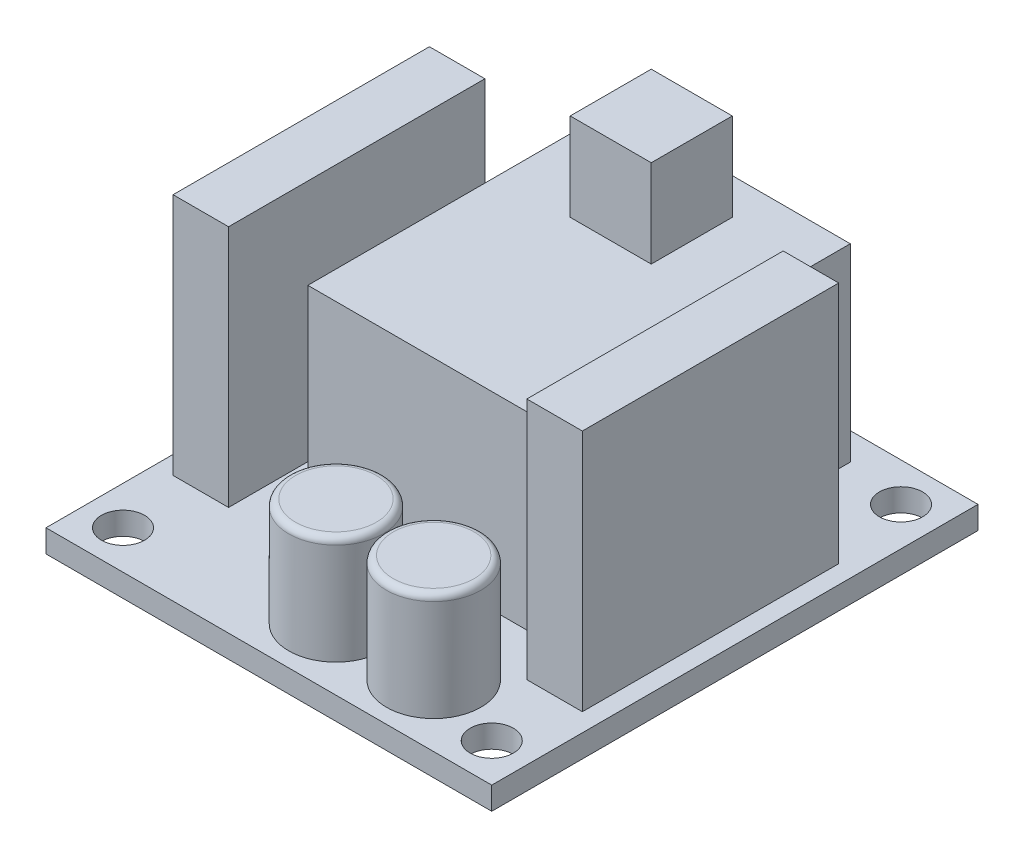
ISO-10303-21;
HEADER;
FILE_DESCRIPTION(('STEP AP214'),'2;1');
FILE_NAME('part.step','',(''),(''),'','','');
FILE_SCHEMA(('AUTOMOTIVE_DESIGN { 1 0 10303 214 1 1 1 1 }'));
ENDSEC;
DATA;
#1=APPLICATION_CONTEXT('core data for automotive mechanical design processes');
#2=APPLICATION_PROTOCOL_DEFINITION('international standard','automotive_design',2000,#1);
#3=PRODUCT_CONTEXT('',#1,'mechanical');
#4=PRODUCT('Part','Part','',(#3));
#5=PRODUCT_RELATED_PRODUCT_CATEGORY('part','',(#4));
#6=PRODUCT_DEFINITION_FORMATION('','',#4);
#7=PRODUCT_DEFINITION_CONTEXT('part definition',#1,'design');
#8=PRODUCT_DEFINITION('design','',#6,#7);
#9=PRODUCT_DEFINITION_SHAPE('','',#8);
#10=(LENGTH_UNIT() NAMED_UNIT(*) SI_UNIT(.MILLI.,.METRE.));
#11=(NAMED_UNIT(*) PLANE_ANGLE_UNIT() SI_UNIT($,.RADIAN.));
#12=(NAMED_UNIT(*) SI_UNIT($,.STERADIAN.) SOLID_ANGLE_UNIT());
#13=UNCERTAINTY_MEASURE_WITH_UNIT(LENGTH_MEASURE(1.E-05),#10,'distance_accuracy_value','');
#14=(GEOMETRIC_REPRESENTATION_CONTEXT(3) GLOBAL_UNCERTAINTY_ASSIGNED_CONTEXT((#13)) GLOBAL_UNIT_ASSIGNED_CONTEXT((#10,
#11,#12)) REPRESENTATION_CONTEXT('',''));
#15=CARTESIAN_POINT('',(0.,0.,0.));
#16=DIRECTION('',(0.,0.,1.));
#17=DIRECTION('',(1.,0.,0.));
#18=AXIS2_PLACEMENT_3D('',#15,#16,#17);
#19=CARTESIAN_POINT('',(0.,1.68,0.));
#20=DIRECTION('',(0.,-1.,0.));
#21=DIRECTION('',(0.,0.,-1.));
#22=AXIS2_PLACEMENT_3D('',#19,#20,#21);
#23=PLANE('',#22);
#24=CARTESIAN_POINT('',(0.380282146725575,1.68,13.4142716533997));
#25=DIRECTION('',(0.,-1.,0.));
#26=DIRECTION('',(0.,0.,-1.));
#27=AXIS2_PLACEMENT_3D('',#24,#25,#26);
#28=CIRCLE('',#27,3.49538502203693);
#29=CARTESIAN_POINT('',(0.380282146725575,1.68,9.91888663136274));
#30=VERTEX_POINT('',#29);
#31=EDGE_CURVE('E361',#30,#30,#28,.F.);
#32=ORIENTED_EDGE('',*,*,#31,.F.);
#33=EDGE_LOOP('',(#32));
#34=FACE_BOUND('',#33,.T.);
#35=CARTESIAN_POINT('',(7.61678506029866,1.68,13.4142716533997));
#36=DIRECTION('',(0.,-1.,0.));
#37=DIRECTION('',(0.,0.,-1.));
#38=AXIS2_PLACEMENT_3D('',#35,#36,#37);
#39=CIRCLE('',#38,3.49538502203694);
#40=CARTESIAN_POINT('',(7.61678506029866,1.68,9.91888663136274));
#41=VERTEX_POINT('',#40);
#42=EDGE_CURVE('E358',#41,#41,#39,.F.);
#43=ORIENTED_EDGE('',*,*,#42,.F.);
#44=EDGE_LOOP('',(#43));
#45=FACE_BOUND('',#44,.T.);
#46=DIRECTION('',(1.,0.,0.));
#47=VECTOR('',#46,1.);
#48=CARTESIAN_POINT('',(15.1508537581453,1.68,-9.03670777019316));
#49=LINE('',#48,#47);
#50=CARTESIAN_POINT('',(11.0421476542415,1.68,-9.03670777019316));
#51=VERTEX_POINT('',#50);
#52=CARTESIAN_POINT('',(15.1508537581453,1.68,-9.03670777019316));
#53=VERTEX_POINT('',#52);
#54=EDGE_CURVE('E204',#51,#53,#49,.T.);
#55=ORIENTED_EDGE('',*,*,#54,.T.);
#56=DIRECTION('',(0.,0.,1.));
#57=VECTOR('',#56,1.);
#58=CARTESIAN_POINT('',(15.1508537581453,1.68,-9.03670777019316));
#59=LINE('',#58,#57);
#60=CARTESIAN_POINT('',(15.1508537581453,1.68,9.94160137641019));
#61=VERTEX_POINT('',#60);
#62=EDGE_CURVE('E178',#53,#61,#59,.T.);
#63=ORIENTED_EDGE('',*,*,#62,.T.);
#64=DIRECTION('',(-1.,0.,0.));
#65=VECTOR('',#64,1.);
#66=CARTESIAN_POINT('',(15.1508537581453,1.68,9.94160137641019));
#67=LINE('',#66,#65);
#68=CARTESIAN_POINT('',(11.0421476542415,1.68,9.94160137641019));
#69=VERTEX_POINT('',#68);
#70=EDGE_CURVE('E194',#61,#69,#67,.T.);
#71=ORIENTED_EDGE('',*,*,#70,.T.);
#72=DIRECTION('',(0.,0.,-1.));
#73=VECTOR('',#72,1.);
#74=CARTESIAN_POINT('',(11.0421476542415,1.68,-9.03670777019316));
#75=LINE('',#74,#73);
#76=EDGE_CURVE('E50',#69,#51,#75,.T.);
#77=ORIENTED_EDGE('',*,*,#76,.T.);
#78=EDGE_LOOP('',(#55,#63,#71,#77));
#79=FACE_BOUND('',#78,.T.);
#80=DIRECTION('',(0.,0.,1.));
#81=VECTOR('',#80,1.);
#82=CARTESIAN_POINT('',(-8.35192341954258,1.68,-15.9823776125068));
#83=LINE('',#82,#81);
#84=CARTESIAN_POINT('',(-8.35192341954258,1.68,-15.9823776125068));
#85=VERTEX_POINT('',#84);
#86=CARTESIAN_POINT('',(-8.35192341954258,1.68,6.76224546267502));
#87=VERTEX_POINT('',#86);
#88=EDGE_CURVE('E271',#85,#87,#83,.T.);
#89=ORIENTED_EDGE('',*,*,#88,.F.);
#90=DIRECTION('',(-1.,0.,0.));
#91=VECTOR('',#90,1.);
#92=CARTESIAN_POINT('',(-8.35192341954258,1.68,-15.9823776125068));
#93=LINE('',#92,#91);
#94=CARTESIAN_POINT('',(9.06116435414502,1.68,-15.9823776125068));
#95=VERTEX_POINT('',#94);
#96=EDGE_CURVE('E276',#95,#85,#93,.T.);
#97=ORIENTED_EDGE('',*,*,#96,.F.);
#98=DIRECTION('',(0.,0.,-1.));
#99=VECTOR('',#98,1.);
#100=CARTESIAN_POINT('',(9.06116435414502,1.68,-15.9823776125068));
#101=LINE('',#100,#99);
#102=CARTESIAN_POINT('',(9.06116435414502,1.68,6.76224546267502));
#103=VERTEX_POINT('',#102);
#104=EDGE_CURVE('E288',#103,#95,#101,.T.);
#105=ORIENTED_EDGE('',*,*,#104,.F.);
#106=DIRECTION('',(1.,0.,0.));
#107=VECTOR('',#106,1.);
#108=CARTESIAN_POINT('',(-8.35192341954258,1.68,6.76224546267502));
#109=LINE('',#108,#107);
#110=EDGE_CURVE('E285',#87,#103,#109,.T.);
#111=ORIENTED_EDGE('',*,*,#110,.F.);
#112=EDGE_LOOP('',(#89,#97,#105,#111));
#113=FACE_BOUND('',#112,.T.);
#114=DIRECTION('',(0.,0.,-1.));
#115=VECTOR('',#114,1.);
#116=CARTESIAN_POINT('',(16.5,1.68,18.));
#117=LINE('',#116,#115);
#118=CARTESIAN_POINT('',(16.5,1.68,18.));
#119=VERTEX_POINT('',#118);
#120=CARTESIAN_POINT('',(16.5,1.68,-18.));
#121=VERTEX_POINT('',#120);
#122=EDGE_CURVE('E329',#119,#121,#117,.T.);
#123=ORIENTED_EDGE('',*,*,#122,.T.);
#124=DIRECTION('',(-1.,0.,0.));
#125=VECTOR('',#124,1.);
#126=CARTESIAN_POINT('',(-16.5,1.68,-18.));
#127=LINE('',#126,#125);
#128=CARTESIAN_POINT('',(-16.5,1.68,-18.));
#129=VERTEX_POINT('',#128);
#130=EDGE_CURVE('E332',#121,#129,#127,.T.);
#131=ORIENTED_EDGE('',*,*,#130,.T.);
#132=DIRECTION('',(0.,0.,1.));
#133=VECTOR('',#132,1.);
#134=CARTESIAN_POINT('',(-16.5,1.68,18.));
#135=LINE('',#134,#133);
#136=CARTESIAN_POINT('',(-16.5,1.68,18.));
#137=VERTEX_POINT('',#136);
#138=EDGE_CURVE('E335',#129,#137,#135,.T.);
#139=ORIENTED_EDGE('',*,*,#138,.T.);
#140=DIRECTION('',(1.,0.,0.));
#141=VECTOR('',#140,1.);
#142=CARTESIAN_POINT('',(-16.5,1.68,18.));
#143=LINE('',#142,#141);
#144=EDGE_CURVE('E337',#137,#119,#143,.T.);
#145=ORIENTED_EDGE('',*,*,#144,.T.);
#146=EDGE_LOOP('',(#123,#131,#139,#145));
#147=FACE_BOUND('',#146,.T.);
#148=CARTESIAN_POINT('',(-13.65,1.68,-15.15));
#149=DIRECTION('',(0.,1.,0.));
#150=DIRECTION('',(0.,0.,1.));
#151=AXIS2_PLACEMENT_3D('',#148,#149,#150);
#152=CIRCLE('',#151,1.6);
#153=CARTESIAN_POINT('',(-13.65,1.68,-13.55));
#154=VERTEX_POINT('',#153);
#155=EDGE_CURVE('E323',#154,#154,#152,.T.);
#156=ORIENTED_EDGE('',*,*,#155,.F.);
#157=EDGE_LOOP('',(#156));
#158=FACE_BOUND('',#157,.T.);
#159=CARTESIAN_POINT('',(13.65,1.68,15.15));
#160=DIRECTION('',(0.,1.,0.));
#161=DIRECTION('',(0.,0.,1.));
#162=AXIS2_PLACEMENT_3D('',#159,#160,#161);
#163=CIRCLE('',#162,1.6);
#164=CARTESIAN_POINT('',(13.65,1.68,16.75));
#165=VERTEX_POINT('',#164);
#166=EDGE_CURVE('E317',#165,#165,#163,.T.);
#167=ORIENTED_EDGE('',*,*,#166,.F.);
#168=EDGE_LOOP('',(#167));
#169=FACE_BOUND('',#168,.T.);
#170=CARTESIAN_POINT('',(13.65,1.68,-15.15));
#171=DIRECTION('',(0.,1.,0.));
#172=DIRECTION('',(0.,0.,1.));
#173=AXIS2_PLACEMENT_3D('',#170,#171,#172);
#174=CIRCLE('',#173,1.6);
#175=CARTESIAN_POINT('',(13.65,1.68,-13.55));
#176=VERTEX_POINT('',#175);
#177=EDGE_CURVE('E311',#176,#176,#174,.T.);
#178=ORIENTED_EDGE('',*,*,#177,.F.);
#179=EDGE_LOOP('',(#178));
#180=FACE_BOUND('',#179,.T.);
#181=CARTESIAN_POINT('',(-13.65,1.68,15.15));
#182=DIRECTION('',(0.,1.,0.));
#183=DIRECTION('',(0.,0.,1.));
#184=AXIS2_PLACEMENT_3D('',#181,#182,#183);
#185=CIRCLE('',#184,1.6);
#186=CARTESIAN_POINT('',(-13.65,1.68,16.75));
#187=VERTEX_POINT('',#186);
#188=EDGE_CURVE('E305',#187,#187,#185,.T.);
#189=ORIENTED_EDGE('',*,*,#188,.F.);
#190=EDGE_LOOP('',(#189));
#191=FACE_BOUND('',#190,.T.);
#192=DIRECTION('',(0.,0.,1.));
#193=VECTOR('',#192,1.);
#194=CARTESIAN_POINT('',(-15.1508537581453,1.68,-9.03670777019316));
#195=LINE('',#194,#193);
#196=CARTESIAN_POINT('',(-15.1508537581453,1.68,-9.03670777019316));
#197=VERTEX_POINT('',#196);
#198=CARTESIAN_POINT('',(-15.1508537581453,1.68,9.94160137641019));
#199=VERTEX_POINT('',#198);
#200=EDGE_CURVE('E183',#197,#199,#195,.T.);
#201=ORIENTED_EDGE('',*,*,#200,.F.);
#202=DIRECTION('',(-1.,0.,0.));
#203=VECTOR('',#202,1.);
#204=CARTESIAN_POINT('',(-15.1508537581453,1.68,-9.03670777019316));
#205=LINE('',#204,#203);
#206=CARTESIAN_POINT('',(-11.0421476542415,1.68,-9.03670777019316));
#207=VERTEX_POINT('',#206);
#208=EDGE_CURVE('E217',#207,#197,#205,.T.);
#209=ORIENTED_EDGE('',*,*,#208,.F.);
#210=DIRECTION('',(0.,0.,-1.));
#211=VECTOR('',#210,1.);
#212=CARTESIAN_POINT('',(-11.0421476542415,1.68,-9.03670777019316));
#213=LINE('',#212,#211);
#214=CARTESIAN_POINT('',(-11.0421476542415,1.68,9.94160137641019));
#215=VERTEX_POINT('',#214);
#216=EDGE_CURVE('E227',#215,#207,#213,.T.);
#217=ORIENTED_EDGE('',*,*,#216,.F.);
#218=DIRECTION('',(1.,0.,0.));
#219=VECTOR('',#218,1.);
#220=CARTESIAN_POINT('',(-15.1508537581453,1.68,9.94160137641019));
#221=LINE('',#220,#219);
#222=EDGE_CURVE('E58',#199,#215,#221,.T.);
#223=ORIENTED_EDGE('',*,*,#222,.F.);
#224=EDGE_LOOP('',(#201,#209,#217,#223));
#225=FACE_BOUND('',#224,.T.);
#226=ADVANCED_FACE('F35',(#34,#45,#79,#113,#147,#158,#169,#180,#191,#225),#23,.F.);
#227=CARTESIAN_POINT('',(0.,15.68,0.));
#228=DIRECTION('',(0.,1.,0.));
#229=DIRECTION('',(0.,0.,1.));
#230=AXIS2_PLACEMENT_3D('',#227,#228,#229);
#231=PLANE('',#230);
#232=DIRECTION('',(0.,0.,1.));
#233=VECTOR('',#232,1.);
#234=CARTESIAN_POINT('',(-8.35192341954258,15.68,-15.9823776125068));
#235=LINE('',#234,#233);
#236=CARTESIAN_POINT('',(-8.35192341954258,15.68,-15.9823776125068));
#237=VERTEX_POINT('',#236);
#238=CARTESIAN_POINT('',(-8.35192341954258,15.68,6.76224546267502));
#239=VERTEX_POINT('',#238);
#240=EDGE_CURVE('E272',#237,#239,#235,.T.);
#241=ORIENTED_EDGE('',*,*,#240,.T.);
#242=DIRECTION('',(1.,0.,0.));
#243=VECTOR('',#242,1.);
#244=CARTESIAN_POINT('',(-8.35192341954258,15.68,6.76224546267502));
#245=LINE('',#244,#243);
#246=CARTESIAN_POINT('',(9.06116435414502,15.68,6.76224546267502));
#247=VERTEX_POINT('',#246);
#248=EDGE_CURVE('E275',#239,#247,#245,.T.);
#249=ORIENTED_EDGE('',*,*,#248,.T.);
#250=DIRECTION('',(0.,0.,-1.));
#251=VECTOR('',#250,1.);
#252=CARTESIAN_POINT('',(9.06116435414502,15.68,-15.9823776125068));
#253=LINE('',#252,#251);
#254=CARTESIAN_POINT('',(9.06116435414502,15.68,-15.9823776125068));
#255=VERTEX_POINT('',#254);
#256=EDGE_CURVE('E278',#247,#255,#253,.T.);
#257=ORIENTED_EDGE('',*,*,#256,.T.);
#258=DIRECTION('',(-1.,0.,0.));
#259=VECTOR('',#258,1.);
#260=CARTESIAN_POINT('',(-8.35192341954258,15.68,-15.9823776125068));
#261=LINE('',#260,#259);
#262=EDGE_CURVE('E280',#255,#237,#261,.T.);
#263=ORIENTED_EDGE('',*,*,#262,.T.);
#264=EDGE_LOOP('',(#241,#249,#257,#263));
#265=FACE_BOUND('',#264,.T.);
#266=DIRECTION('',(-1.,0.,0.));
#267=VECTOR('',#266,1.);
#268=CARTESIAN_POINT('',(-3.,15.68,-13.3084501356873));
#269=LINE('',#268,#267);
#270=CARTESIAN_POINT('',(3.,15.68,-13.3084501356873));
#271=VERTEX_POINT('',#270);
#272=CARTESIAN_POINT('',(-3.,15.68,-13.3084501356873));
#273=VERTEX_POINT('',#272);
#274=EDGE_CURVE('E256',#271,#273,#269,.T.);
#275=ORIENTED_EDGE('',*,*,#274,.F.);
#276=DIRECTION('',(0.,0.,-1.));
#277=VECTOR('',#276,1.);
#278=CARTESIAN_POINT('',(3.,15.68,-7.30845013568731));
#279=LINE('',#278,#277);
#280=CARTESIAN_POINT('',(3.,15.68,-7.30845013568731));
#281=VERTEX_POINT('',#280);
#282=EDGE_CURVE('E242',#281,#271,#279,.T.);
#283=ORIENTED_EDGE('',*,*,#282,.F.);
#284=DIRECTION('',(1.,0.,0.));
#285=VECTOR('',#284,1.);
#286=CARTESIAN_POINT('',(-3.,15.68,-7.30845013568731));
#287=LINE('',#286,#285);
#288=CARTESIAN_POINT('',(-3.,15.68,-7.30845013568731));
#289=VERTEX_POINT('',#288);
#290=EDGE_CURVE('E247',#289,#281,#287,.T.);
#291=ORIENTED_EDGE('',*,*,#290,.F.);
#292=DIRECTION('',(0.,0.,1.));
#293=VECTOR('',#292,1.);
#294=CARTESIAN_POINT('',(-3.,15.68,-7.30845013568731));
#295=LINE('',#294,#293);
#296=EDGE_CURVE('E258',#273,#289,#295,.T.);
#297=ORIENTED_EDGE('',*,*,#296,.F.);
#298=EDGE_LOOP('',(#275,#283,#291,#297));
#299=FACE_BOUND('',#298,.T.);
#300=ADVANCED_FACE('F384',(#265,#299),#231,.T.);
#301=CARTESIAN_POINT('',(0.,0.,0.));
#302=DIRECTION('',(0.,-1.,0.));
#303=DIRECTION('',(0.,0.,-1.));
#304=AXIS2_PLACEMENT_3D('',#301,#302,#303);
#305=PLANE('',#304);
#306=CARTESIAN_POINT('',(13.65,0.,-15.15));
#307=DIRECTION('',(0.,1.,0.));
#308=DIRECTION('',(0.,0.,1.));
#309=AXIS2_PLACEMENT_3D('',#306,#307,#308);
#310=CIRCLE('',#309,1.6);
#311=CARTESIAN_POINT('',(13.65,0.,-13.55));
#312=VERTEX_POINT('',#311);
#313=EDGE_CURVE('E308',#312,#312,#310,.T.);
#314=ORIENTED_EDGE('',*,*,#313,.T.);
#315=EDGE_LOOP('',(#314));
#316=FACE_BOUND('',#315,.T.);
#317=CARTESIAN_POINT('',(-13.65,0.,-15.15));
#318=DIRECTION('',(0.,1.,0.));
#319=DIRECTION('',(0.,0.,1.));
#320=AXIS2_PLACEMENT_3D('',#317,#318,#319);
#321=CIRCLE('',#320,1.6);
#322=CARTESIAN_POINT('',(-13.65,0.,-13.55));
#323=VERTEX_POINT('',#322);
#324=EDGE_CURVE('E320',#323,#323,#321,.T.);
#325=ORIENTED_EDGE('',*,*,#324,.T.);
#326=EDGE_LOOP('',(#325));
#327=FACE_BOUND('',#326,.T.);
#328=DIRECTION('',(0.,0.,-1.));
#329=VECTOR('',#328,1.);
#330=CARTESIAN_POINT('',(16.5,0.,18.));
#331=LINE('',#330,#329);
#332=CARTESIAN_POINT('',(16.5,0.,18.));
#333=VERTEX_POINT('',#332);
#334=CARTESIAN_POINT('',(16.5,0.,-18.));
#335=VERTEX_POINT('',#334);
#336=EDGE_CURVE('E326',#333,#335,#331,.T.);
#337=ORIENTED_EDGE('',*,*,#336,.F.);
#338=DIRECTION('',(1.,0.,0.));
#339=VECTOR('',#338,1.);
#340=CARTESIAN_POINT('',(-16.5,0.,18.));
#341=LINE('',#340,#339);
#342=CARTESIAN_POINT('',(-16.5,0.,18.));
#343=VERTEX_POINT('',#342);
#344=EDGE_CURVE('E333',#343,#333,#341,.T.);
#345=ORIENTED_EDGE('',*,*,#344,.F.);
#346=DIRECTION('',(0.,0.,1.));
#347=VECTOR('',#346,1.);
#348=CARTESIAN_POINT('',(-16.5,0.,18.));
#349=LINE('',#348,#347);
#350=CARTESIAN_POINT('',(-16.5,0.,-18.));
#351=VERTEX_POINT('',#350);
#352=EDGE_CURVE('E344',#351,#343,#349,.T.);
#353=ORIENTED_EDGE('',*,*,#352,.F.);
#354=DIRECTION('',(-1.,0.,0.));
#355=VECTOR('',#354,1.);
#356=CARTESIAN_POINT('',(-16.5,0.,-18.));
#357=LINE('',#356,#355);
#358=EDGE_CURVE('E342',#335,#351,#357,.T.);
#359=ORIENTED_EDGE('',*,*,#358,.F.);
#360=EDGE_LOOP('',(#337,#345,#353,#359));
#361=FACE_BOUND('',#360,.T.);
#362=CARTESIAN_POINT('',(13.65,0.,15.15));
#363=DIRECTION('',(0.,1.,0.));
#364=DIRECTION('',(0.,0.,1.));
#365=AXIS2_PLACEMENT_3D('',#362,#363,#364);
#366=CIRCLE('',#365,1.6);
#367=CARTESIAN_POINT('',(13.65,0.,16.75));
#368=VERTEX_POINT('',#367);
#369=EDGE_CURVE('E314',#368,#368,#366,.T.);
#370=ORIENTED_EDGE('',*,*,#369,.T.);
#371=EDGE_LOOP('',(#370));
#372=FACE_BOUND('',#371,.T.);
#373=CARTESIAN_POINT('',(-13.65,0.,15.15));
#374=DIRECTION('',(0.,1.,0.));
#375=DIRECTION('',(0.,0.,1.));
#376=AXIS2_PLACEMENT_3D('',#373,#374,#375);
#377=CIRCLE('',#376,1.6);
#378=CARTESIAN_POINT('',(-13.65,0.,16.75));
#379=VERTEX_POINT('',#378);
#380=EDGE_CURVE('E304',#379,#379,#377,.T.);
#381=ORIENTED_EDGE('',*,*,#380,.T.);
#382=EDGE_LOOP('',(#381));
#383=FACE_BOUND('',#382,.T.);
#384=ADVANCED_FACE('F390',(#316,#327,#361,#372,#383),#305,.T.);
#385=CARTESIAN_POINT('',(16.5,1.68,18.));
#386=DIRECTION('',(-1.,0.,0.));
#387=DIRECTION('',(0.,0.,1.));
#388=AXIS2_PLACEMENT_3D('',#385,#386,#387);
#389=PLANE('',#388);
#390=ORIENTED_EDGE('',*,*,#336,.T.);
#391=DIRECTION('',(0.,-1.,0.));
#392=VECTOR('',#391,1.);
#393=CARTESIAN_POINT('',(16.5,1.68,-18.));
#394=LINE('',#393,#392);
#395=EDGE_CURVE('E355',#121,#335,#394,.T.);
#396=ORIENTED_EDGE('',*,*,#395,.F.);
#397=ORIENTED_EDGE('',*,*,#122,.F.);
#398=DIRECTION('',(0.,-1.,0.));
#399=VECTOR('',#398,1.);
#400=CARTESIAN_POINT('',(16.5,1.68,18.));
#401=LINE('',#400,#399);
#402=EDGE_CURVE('E339',#119,#333,#401,.T.);
#403=ORIENTED_EDGE('',*,*,#402,.T.);
#404=EDGE_LOOP('',(#390,#396,#397,#403));
#405=FACE_BOUND('',#404,.T.);
#406=ADVANCED_FACE('F401',(#405),#389,.F.);
#407=CARTESIAN_POINT('',(-16.5,1.68,-18.));
#408=DIRECTION('',(0.,0.,1.));
#409=DIRECTION('',(1.,0.,0.));
#410=AXIS2_PLACEMENT_3D('',#407,#408,#409);
#411=PLANE('',#410);
#412=ORIENTED_EDGE('',*,*,#358,.T.);
#413=DIRECTION('',(0.,-1.,0.));
#414=VECTOR('',#413,1.);
#415=CARTESIAN_POINT('',(-16.5,1.68,-18.));
#416=LINE('',#415,#414);
#417=EDGE_CURVE('E352',#129,#351,#416,.T.);
#418=ORIENTED_EDGE('',*,*,#417,.F.);
#419=ORIENTED_EDGE('',*,*,#130,.F.);
#420=ORIENTED_EDGE('',*,*,#395,.T.);
#421=EDGE_LOOP('',(#412,#418,#419,#420));
#422=FACE_BOUND('',#421,.T.);
#423=ADVANCED_FACE('F410',(#422),#411,.F.);
#424=CARTESIAN_POINT('',(-16.5,1.68,18.));
#425=DIRECTION('',(1.,0.,0.));
#426=DIRECTION('',(0.,0.,-1.));
#427=AXIS2_PLACEMENT_3D('',#424,#425,#426);
#428=PLANE('',#427);
#429=ORIENTED_EDGE('',*,*,#352,.T.);
#430=DIRECTION('',(0.,-1.,0.));
#431=VECTOR('',#430,1.);
#432=CARTESIAN_POINT('',(-16.5,1.68,18.));
#433=LINE('',#432,#431);
#434=EDGE_CURVE('E349',#137,#343,#433,.T.);
#435=ORIENTED_EDGE('',*,*,#434,.F.);
#436=ORIENTED_EDGE('',*,*,#138,.F.);
#437=ORIENTED_EDGE('',*,*,#417,.T.);
#438=EDGE_LOOP('',(#429,#435,#436,#437));
#439=FACE_BOUND('',#438,.T.);
#440=ADVANCED_FACE('F406',(#439),#428,.F.);
#441=CARTESIAN_POINT('',(-16.5,1.68,18.));
#442=DIRECTION('',(0.,0.,-1.));
#443=DIRECTION('',(-1.,0.,0.));
#444=AXIS2_PLACEMENT_3D('',#441,#442,#443);
#445=PLANE('',#444);
#446=ORIENTED_EDGE('',*,*,#344,.T.);
#447=ORIENTED_EDGE('',*,*,#402,.F.);
#448=ORIENTED_EDGE('',*,*,#144,.F.);
#449=ORIENTED_EDGE('',*,*,#434,.T.);
#450=EDGE_LOOP('',(#446,#447,#448,#449));
#451=FACE_BOUND('',#450,.T.);
#452=ADVANCED_FACE('F403',(#451),#445,.F.);
#453=CARTESIAN_POINT('',(-13.65,1.68,-15.15));
#454=DIRECTION('',(0.,-1.,0.));
#455=DIRECTION('',(0.,0.,-1.));
#456=AXIS2_PLACEMENT_3D('',#453,#454,#455);
#457=CYLINDRICAL_SURFACE('',#456,1.6);
#458=ORIENTED_EDGE('',*,*,#155,.T.);
#459=EDGE_LOOP('',(#458));
#460=FACE_BOUND('',#459,.T.);
#461=ORIENTED_EDGE('',*,*,#324,.F.);
#462=EDGE_LOOP('',(#461));
#463=FACE_BOUND('',#462,.T.);
#464=ADVANCED_FACE('F397',(#460,#463),#457,.F.);
#465=CARTESIAN_POINT('',(13.65,1.68,15.15));
#466=DIRECTION('',(0.,-1.,0.));
#467=DIRECTION('',(0.,0.,-1.));
#468=AXIS2_PLACEMENT_3D('',#465,#466,#467);
#469=CYLINDRICAL_SURFACE('',#468,1.6);
#470=ORIENTED_EDGE('',*,*,#166,.T.);
#471=EDGE_LOOP('',(#470));
#472=FACE_BOUND('',#471,.T.);
#473=ORIENTED_EDGE('',*,*,#369,.F.);
#474=EDGE_LOOP('',(#473));
#475=FACE_BOUND('',#474,.T.);
#476=ADVANCED_FACE('F509',(#472,#475),#469,.F.);
#477=CARTESIAN_POINT('',(13.65,1.68,-15.15));
#478=DIRECTION('',(0.,-1.,0.));
#479=DIRECTION('',(0.,0.,-1.));
#480=AXIS2_PLACEMENT_3D('',#477,#478,#479);
#481=CYLINDRICAL_SURFACE('',#480,1.6);
#482=ORIENTED_EDGE('',*,*,#177,.T.);
#483=EDGE_LOOP('',(#482));
#484=FACE_BOUND('',#483,.T.);
#485=ORIENTED_EDGE('',*,*,#313,.F.);
#486=EDGE_LOOP('',(#485));
#487=FACE_BOUND('',#486,.T.);
#488=ADVANCED_FACE('F506',(#484,#487),#481,.F.);
#489=CARTESIAN_POINT('',(-13.65,1.68,15.15));
#490=DIRECTION('',(0.,-1.,0.));
#491=DIRECTION('',(0.,0.,-1.));
#492=AXIS2_PLACEMENT_3D('',#489,#490,#491);
#493=CYLINDRICAL_SURFACE('',#492,1.6);
#494=ORIENTED_EDGE('',*,*,#188,.T.);
#495=EDGE_LOOP('',(#494));
#496=FACE_BOUND('',#495,.T.);
#497=ORIENTED_EDGE('',*,*,#380,.F.);
#498=EDGE_LOOP('',(#497));
#499=FACE_BOUND('',#498,.T.);
#500=ADVANCED_FACE('F502',(#496,#499),#493,.F.);
#501=CARTESIAN_POINT('',(-8.35192341954258,15.68,-15.9823776125068));
#502=DIRECTION('',(1.,0.,0.));
#503=DIRECTION('',(0.,0.,-1.));
#504=AXIS2_PLACEMENT_3D('',#501,#502,#503);
#505=PLANE('',#504);
#506=ORIENTED_EDGE('',*,*,#88,.T.);
#507=DIRECTION('',(0.,-1.,0.));
#508=VECTOR('',#507,1.);
#509=CARTESIAN_POINT('',(-8.35192341954258,15.68,6.76224546267502));
#510=LINE('',#509,#508);
#511=EDGE_CURVE('E301',#239,#87,#510,.T.);
#512=ORIENTED_EDGE('',*,*,#511,.F.);
#513=ORIENTED_EDGE('',*,*,#240,.F.);
#514=DIRECTION('',(0.,-1.,0.));
#515=VECTOR('',#514,1.);
#516=CARTESIAN_POINT('',(-8.35192341954258,15.68,-15.9823776125068));
#517=LINE('',#516,#515);
#518=EDGE_CURVE('E282',#237,#85,#517,.T.);
#519=ORIENTED_EDGE('',*,*,#518,.T.);
#520=EDGE_LOOP('',(#506,#512,#513,#519));
#521=FACE_BOUND('',#520,.T.);
#522=ADVANCED_FACE('F498',(#521),#505,.F.);
#523=CARTESIAN_POINT('',(-8.35192341954258,15.68,6.76224546267502));
#524=DIRECTION('',(0.,0.,-1.));
#525=DIRECTION('',(-1.,0.,0.));
#526=AXIS2_PLACEMENT_3D('',#523,#524,#525);
#527=PLANE('',#526);
#528=ORIENTED_EDGE('',*,*,#110,.T.);
#529=DIRECTION('',(0.,-1.,0.));
#530=VECTOR('',#529,1.);
#531=CARTESIAN_POINT('',(9.06116435414502,15.68,6.76224546267502));
#532=LINE('',#531,#530);
#533=EDGE_CURVE('E298',#247,#103,#532,.T.);
#534=ORIENTED_EDGE('',*,*,#533,.F.);
#535=ORIENTED_EDGE('',*,*,#248,.F.);
#536=ORIENTED_EDGE('',*,*,#511,.T.);
#537=EDGE_LOOP('',(#528,#534,#535,#536));
#538=FACE_BOUND('',#537,.T.);
#539=ADVANCED_FACE('F494',(#538),#527,.F.);
#540=CARTESIAN_POINT('',(9.06116435414502,15.68,-15.9823776125068));
#541=DIRECTION('',(-1.,0.,0.));
#542=DIRECTION('',(0.,0.,1.));
#543=AXIS2_PLACEMENT_3D('',#540,#541,#542);
#544=PLANE('',#543);
#545=ORIENTED_EDGE('',*,*,#104,.T.);
#546=DIRECTION('',(0.,-1.,0.));
#547=VECTOR('',#546,1.);
#548=CARTESIAN_POINT('',(9.06116435414502,15.68,-15.9823776125068));
#549=LINE('',#548,#547);
#550=EDGE_CURVE('E295',#255,#95,#549,.T.);
#551=ORIENTED_EDGE('',*,*,#550,.F.);
#552=ORIENTED_EDGE('',*,*,#256,.F.);
#553=ORIENTED_EDGE('',*,*,#533,.T.);
#554=EDGE_LOOP('',(#545,#551,#552,#553));
#555=FACE_BOUND('',#554,.T.);
#556=ADVANCED_FACE('F490',(#555),#544,.F.);
#557=CARTESIAN_POINT('',(-8.35192341954258,15.68,-15.9823776125068));
#558=DIRECTION('',(0.,0.,1.));
#559=DIRECTION('',(1.,0.,0.));
#560=AXIS2_PLACEMENT_3D('',#557,#558,#559);
#561=PLANE('',#560);
#562=ORIENTED_EDGE('',*,*,#96,.T.);
#563=ORIENTED_EDGE('',*,*,#518,.F.);
#564=ORIENTED_EDGE('',*,*,#262,.F.);
#565=ORIENTED_EDGE('',*,*,#550,.T.);
#566=EDGE_LOOP('',(#562,#563,#564,#565));
#567=FACE_BOUND('',#566,.T.);
#568=ADVANCED_FACE('F485',(#567),#561,.F.);
#569=CARTESIAN_POINT('',(3.,22.18,-7.30845013568731));
#570=DIRECTION('',(-1.,0.,0.));
#571=DIRECTION('',(0.,0.,1.));
#572=AXIS2_PLACEMENT_3D('',#569,#570,#571);
#573=PLANE('',#572);
#574=ORIENTED_EDGE('',*,*,#282,.T.);
#575=DIRECTION('',(0.,-1.,0.));
#576=VECTOR('',#575,1.);
#577=CARTESIAN_POINT('',(3.,22.18,-13.3084501356873));
#578=LINE('',#577,#576);
#579=CARTESIAN_POINT('',(3.,22.18,-13.3084501356873));
#580=VERTEX_POINT('',#579);
#581=EDGE_CURVE('E269',#580,#271,#578,.T.);
#582=ORIENTED_EDGE('',*,*,#581,.F.);
#583=DIRECTION('',(0.,0.,-1.));
#584=VECTOR('',#583,1.);
#585=CARTESIAN_POINT('',(3.,22.18,-7.30845013568731));
#586=LINE('',#585,#584);
#587=CARTESIAN_POINT('',(3.,22.18,-7.30845013568731));
#588=VERTEX_POINT('',#587);
#589=EDGE_CURVE('E243',#588,#580,#586,.T.);
#590=ORIENTED_EDGE('',*,*,#589,.F.);
#591=DIRECTION('',(0.,-1.,0.));
#592=VECTOR('',#591,1.);
#593=CARTESIAN_POINT('',(3.,22.18,-7.30845013568731));
#594=LINE('',#593,#592);
#595=EDGE_CURVE('E253',#588,#281,#594,.T.);
#596=ORIENTED_EDGE('',*,*,#595,.T.);
#597=EDGE_LOOP('',(#574,#582,#590,#596));
#598=FACE_BOUND('',#597,.T.);
#599=ADVANCED_FACE('F482',(#598),#573,.F.);
#600=CARTESIAN_POINT('',(-3.,22.18,-13.3084501356873));
#601=DIRECTION('',(0.,0.,1.));
#602=DIRECTION('',(1.,0.,0.));
#603=AXIS2_PLACEMENT_3D('',#600,#601,#602);
#604=PLANE('',#603);
#605=ORIENTED_EDGE('',*,*,#274,.T.);
#606=DIRECTION('',(0.,-1.,0.));
#607=VECTOR('',#606,1.);
#608=CARTESIAN_POINT('',(-3.,22.18,-13.3084501356873));
#609=LINE('',#608,#607);
#610=CARTESIAN_POINT('',(-3.,22.18,-13.3084501356873));
#611=VERTEX_POINT('',#610);
#612=EDGE_CURVE('E266',#611,#273,#609,.T.);
#613=ORIENTED_EDGE('',*,*,#612,.F.);
#614=DIRECTION('',(-1.,0.,0.));
#615=VECTOR('',#614,1.);
#616=CARTESIAN_POINT('',(-3.,22.18,-13.3084501356873));
#617=LINE('',#616,#615);
#618=EDGE_CURVE('E246',#580,#611,#617,.T.);
#619=ORIENTED_EDGE('',*,*,#618,.F.);
#620=ORIENTED_EDGE('',*,*,#581,.T.);
#621=EDGE_LOOP('',(#605,#613,#619,#620));
#622=FACE_BOUND('',#621,.T.);
#623=ADVANCED_FACE('F478',(#622),#604,.F.);
#624=CARTESIAN_POINT('',(-3.,22.18,-7.30845013568731));
#625=DIRECTION('',(1.,0.,0.));
#626=DIRECTION('',(0.,0.,-1.));
#627=AXIS2_PLACEMENT_3D('',#624,#625,#626);
#628=PLANE('',#627);
#629=ORIENTED_EDGE('',*,*,#296,.T.);
#630=DIRECTION('',(0.,-1.,0.));
#631=VECTOR('',#630,1.);
#632=CARTESIAN_POINT('',(-3.,22.18,-7.30845013568731));
#633=LINE('',#632,#631);
#634=CARTESIAN_POINT('',(-3.,22.18,-7.30845013568731));
#635=VERTEX_POINT('',#634);
#636=EDGE_CURVE('E264',#635,#289,#633,.T.);
#637=ORIENTED_EDGE('',*,*,#636,.F.);
#638=DIRECTION('',(0.,0.,1.));
#639=VECTOR('',#638,1.);
#640=CARTESIAN_POINT('',(-3.,22.18,-7.30845013568731));
#641=LINE('',#640,#639);
#642=EDGE_CURVE('E249',#611,#635,#641,.T.);
#643=ORIENTED_EDGE('',*,*,#642,.F.);
#644=ORIENTED_EDGE('',*,*,#612,.T.);
#645=EDGE_LOOP('',(#629,#637,#643,#644));
#646=FACE_BOUND('',#645,.T.);
#647=ADVANCED_FACE('F474',(#646),#628,.F.);
#648=CARTESIAN_POINT('',(-3.,22.18,-7.30845013568731));
#649=DIRECTION('',(0.,0.,-1.));
#650=DIRECTION('',(-1.,0.,0.));
#651=AXIS2_PLACEMENT_3D('',#648,#649,#650);
#652=PLANE('',#651);
#653=ORIENTED_EDGE('',*,*,#290,.T.);
#654=ORIENTED_EDGE('',*,*,#595,.F.);
#655=DIRECTION('',(1.,0.,0.));
#656=VECTOR('',#655,1.);
#657=CARTESIAN_POINT('',(-3.,22.18,-7.30845013568731));
#658=LINE('',#657,#656);
#659=EDGE_CURVE('E251',#635,#588,#658,.T.);
#660=ORIENTED_EDGE('',*,*,#659,.F.);
#661=ORIENTED_EDGE('',*,*,#636,.T.);
#662=EDGE_LOOP('',(#653,#654,#660,#661));
#663=FACE_BOUND('',#662,.T.);
#664=ADVANCED_FACE('F470',(#663),#652,.F.);
#665=CARTESIAN_POINT('',(0.,22.18,0.));
#666=DIRECTION('',(0.,-1.,0.));
#667=DIRECTION('',(0.,0.,-1.));
#668=AXIS2_PLACEMENT_3D('',#665,#666,#667);
#669=PLANE('',#668);
#670=ORIENTED_EDGE('',*,*,#589,.T.);
#671=ORIENTED_EDGE('',*,*,#618,.T.);
#672=ORIENTED_EDGE('',*,*,#642,.T.);
#673=ORIENTED_EDGE('',*,*,#659,.T.);
#674=EDGE_LOOP('',(#670,#671,#672,#673));
#675=FACE_BOUND('',#674,.T.);
#676=ADVANCED_FACE('F464',(#675),#669,.F.);
#677=CARTESIAN_POINT('',(-15.1508537581453,19.68,-9.03670777019316));
#678=DIRECTION('',(1.,0.,0.));
#679=DIRECTION('',(0.,0.,-1.));
#680=AXIS2_PLACEMENT_3D('',#677,#678,#679);
#681=PLANE('',#680);
#682=ORIENTED_EDGE('',*,*,#200,.T.);
#683=DIRECTION('',(0.,-1.,0.));
#684=VECTOR('',#683,1.);
#685=CARTESIAN_POINT('',(-15.1508537581453,19.68,9.94160137641019));
#686=LINE('',#685,#684);
#687=CARTESIAN_POINT('',(-15.1508537581453,19.68,9.94160137641019));
#688=VERTEX_POINT('',#687);
#689=EDGE_CURVE('E240',#688,#199,#686,.T.);
#690=ORIENTED_EDGE('',*,*,#689,.F.);
#691=DIRECTION('',(0.,0.,1.));
#692=VECTOR('',#691,1.);
#693=CARTESIAN_POINT('',(-15.1508537581453,19.68,-9.03670777019316));
#694=LINE('',#693,#692);
#695=CARTESIAN_POINT('',(-15.1508537581453,19.68,-9.03670777019316));
#696=VERTEX_POINT('',#695);
#697=EDGE_CURVE('E213',#696,#688,#694,.T.);
#698=ORIENTED_EDGE('',*,*,#697,.F.);
#699=DIRECTION('',(0.,-1.,0.));
#700=VECTOR('',#699,1.);
#701=CARTESIAN_POINT('',(-15.1508537581453,19.68,-9.03670777019316));
#702=LINE('',#701,#700);
#703=EDGE_CURVE('E223',#696,#197,#702,.T.);
#704=ORIENTED_EDGE('',*,*,#703,.T.);
#705=EDGE_LOOP('',(#682,#690,#698,#704));
#706=FACE_BOUND('',#705,.T.);
#707=ADVANCED_FACE('F448',(#706),#681,.F.);
#708=CARTESIAN_POINT('',(-15.1508537581453,19.68,9.94160137641019));
#709=DIRECTION('',(0.,0.,-1.));
#710=DIRECTION('',(-1.,0.,0.));
#711=AXIS2_PLACEMENT_3D('',#708,#709,#710);
#712=PLANE('',#711);
#713=ORIENTED_EDGE('',*,*,#222,.T.);
#714=DIRECTION('',(0.,-1.,0.));
#715=VECTOR('',#714,1.);
#716=CARTESIAN_POINT('',(-11.0421476542415,19.68,9.94160137641019));
#717=LINE('',#716,#715);
#718=CARTESIAN_POINT('',(-11.0421476542415,19.68,9.94160137641019));
#719=VERTEX_POINT('',#718);
#720=EDGE_CURVE('E237',#719,#215,#717,.T.);
#721=ORIENTED_EDGE('',*,*,#720,.F.);
#722=DIRECTION('',(1.,0.,0.));
#723=VECTOR('',#722,1.);
#724=CARTESIAN_POINT('',(-15.1508537581453,19.68,9.94160137641019));
#725=LINE('',#724,#723);
#726=EDGE_CURVE('E216',#688,#719,#725,.T.);
#727=ORIENTED_EDGE('',*,*,#726,.F.);
#728=ORIENTED_EDGE('',*,*,#689,.T.);
#729=EDGE_LOOP('',(#713,#721,#727,#728));
#730=FACE_BOUND('',#729,.T.);
#731=ADVANCED_FACE('F456',(#730),#712,.F.);
#732=CARTESIAN_POINT('',(-11.0421476542415,19.68,-9.03670777019316));
#733=DIRECTION('',(-1.,0.,0.));
#734=DIRECTION('',(0.,0.,1.));
#735=AXIS2_PLACEMENT_3D('',#732,#733,#734);
#736=PLANE('',#735);
#737=ORIENTED_EDGE('',*,*,#216,.T.);
#738=DIRECTION('',(0.,-1.,0.));
#739=VECTOR('',#738,1.);
#740=CARTESIAN_POINT('',(-11.0421476542415,19.68,-9.03670777019316));
#741=LINE('',#740,#739);
#742=CARTESIAN_POINT('',(-11.0421476542415,19.68,-9.03670777019316));
#743=VERTEX_POINT('',#742);
#744=EDGE_CURVE('E234',#743,#207,#741,.T.);
#745=ORIENTED_EDGE('',*,*,#744,.F.);
#746=DIRECTION('',(0.,0.,-1.));
#747=VECTOR('',#746,1.);
#748=CARTESIAN_POINT('',(-11.0421476542415,19.68,-9.03670777019316));
#749=LINE('',#748,#747);
#750=EDGE_CURVE('E219',#719,#743,#749,.T.);
#751=ORIENTED_EDGE('',*,*,#750,.F.);
#752=ORIENTED_EDGE('',*,*,#720,.T.);
#753=EDGE_LOOP('',(#737,#745,#751,#752));
#754=FACE_BOUND('',#753,.T.);
#755=ADVANCED_FACE('F454',(#754),#736,.F.);
#756=CARTESIAN_POINT('',(-15.1508537581453,19.68,-9.03670777019316));
#757=DIRECTION('',(0.,0.,1.));
#758=DIRECTION('',(1.,0.,0.));
#759=AXIS2_PLACEMENT_3D('',#756,#757,#758);
#760=PLANE('',#759);
#761=ORIENTED_EDGE('',*,*,#208,.T.);
#762=ORIENTED_EDGE('',*,*,#703,.F.);
#763=DIRECTION('',(-1.,0.,0.));
#764=VECTOR('',#763,1.);
#765=CARTESIAN_POINT('',(-15.1508537581453,19.68,-9.03670777019316));
#766=LINE('',#765,#764);
#767=EDGE_CURVE('E221',#743,#696,#766,.T.);
#768=ORIENTED_EDGE('',*,*,#767,.F.);
#769=ORIENTED_EDGE('',*,*,#744,.T.);
#770=EDGE_LOOP('',(#761,#762,#768,#769));
#771=FACE_BOUND('',#770,.T.);
#772=ADVANCED_FACE('F444',(#771),#760,.F.);
#773=CARTESIAN_POINT('',(0.,19.68,0.));
#774=DIRECTION('',(0.,1.,0.));
#775=DIRECTION('',(0.,0.,1.));
#776=AXIS2_PLACEMENT_3D('',#773,#774,#775);
#777=PLANE('',#776);
#778=ORIENTED_EDGE('',*,*,#697,.T.);
#779=ORIENTED_EDGE('',*,*,#726,.T.);
#780=ORIENTED_EDGE('',*,*,#750,.T.);
#781=ORIENTED_EDGE('',*,*,#767,.T.);
#782=EDGE_LOOP('',(#778,#779,#780,#781));
#783=FACE_BOUND('',#782,.T.);
#784=ADVANCED_FACE('F450',(#783),#777,.T.);
#785=CARTESIAN_POINT('',(15.1508537581453,19.68,-9.03670777019316));
#786=DIRECTION('',(1.,0.,0.));
#787=DIRECTION('',(0.,0.,-1.));
#788=AXIS2_PLACEMENT_3D('',#785,#786,#787);
#789=PLANE('',#788);
#790=ORIENTED_EDGE('',*,*,#62,.F.);
#791=DIRECTION('',(0.,-1.,0.));
#792=VECTOR('',#791,1.);
#793=CARTESIAN_POINT('',(15.1508537581453,19.68,-9.03670777019316));
#794=LINE('',#793,#792);
#795=CARTESIAN_POINT('',(15.1508537581453,19.68,-9.03670777019316));
#796=VERTEX_POINT('',#795);
#797=EDGE_CURVE('E172',#796,#53,#794,.T.);
#798=ORIENTED_EDGE('',*,*,#797,.F.);
#799=DIRECTION('',(0.,0.,1.));
#800=VECTOR('',#799,1.);
#801=CARTESIAN_POINT('',(15.1508537581453,19.68,-9.03670777019316));
#802=LINE('',#801,#800);
#803=CARTESIAN_POINT('',(15.1508537581453,19.68,9.94160137641019));
#804=VERTEX_POINT('',#803);
#805=EDGE_CURVE('E175',#796,#804,#802,.T.);
#806=ORIENTED_EDGE('',*,*,#805,.T.);
#807=DIRECTION('',(0.,-1.,0.));
#808=VECTOR('',#807,1.);
#809=CARTESIAN_POINT('',(15.1508537581453,19.68,9.94160137641019));
#810=LINE('',#809,#808);
#811=EDGE_CURVE('E202',#804,#61,#810,.T.);
#812=ORIENTED_EDGE('',*,*,#811,.T.);
#813=EDGE_LOOP('',(#790,#798,#806,#812));
#814=FACE_BOUND('',#813,.T.);
#815=ADVANCED_FACE('F174',(#814),#789,.T.);
#816=CARTESIAN_POINT('',(15.1508537581453,19.68,-9.03670777019316));
#817=DIRECTION('',(0.,0.,-1.));
#818=DIRECTION('',(-1.,0.,0.));
#819=AXIS2_PLACEMENT_3D('',#816,#817,#818);
#820=PLANE('',#819);
#821=ORIENTED_EDGE('',*,*,#54,.F.);
#822=DIRECTION('',(0.,-1.,0.));
#823=VECTOR('',#822,1.);
#824=CARTESIAN_POINT('',(11.0421476542415,19.68,-9.03670777019316));
#825=LINE('',#824,#823);
#826=CARTESIAN_POINT('',(11.0421476542415,19.68,-9.03670777019316));
#827=VERTEX_POINT('',#826);
#828=EDGE_CURVE('E184',#827,#51,#825,.T.);
#829=ORIENTED_EDGE('',*,*,#828,.F.);
#830=DIRECTION('',(1.,0.,0.));
#831=VECTOR('',#830,1.);
#832=CARTESIAN_POINT('',(15.1508537581453,19.68,-9.03670777019316));
#833=LINE('',#832,#831);
#834=EDGE_CURVE('E190',#827,#796,#833,.T.);
#835=ORIENTED_EDGE('',*,*,#834,.T.);
#836=ORIENTED_EDGE('',*,*,#797,.T.);
#837=EDGE_LOOP('',(#821,#829,#835,#836));
#838=FACE_BOUND('',#837,.T.);
#839=ADVANCED_FACE('F196',(#838),#820,.T.);
#840=CARTESIAN_POINT('',(11.0421476542415,19.68,-9.03670777019316));
#841=DIRECTION('',(-1.,0.,0.));
#842=DIRECTION('',(0.,0.,1.));
#843=AXIS2_PLACEMENT_3D('',#840,#841,#842);
#844=PLANE('',#843);
#845=ORIENTED_EDGE('',*,*,#76,.F.);
#846=DIRECTION('',(0.,-1.,0.));
#847=VECTOR('',#846,1.);
#848=CARTESIAN_POINT('',(11.0421476542415,19.68,9.94160137641019));
#849=LINE('',#848,#847);
#850=CARTESIAN_POINT('',(11.0421476542415,19.68,9.94160137641019));
#851=VERTEX_POINT('',#850);
#852=EDGE_CURVE('E210',#851,#69,#849,.T.);
#853=ORIENTED_EDGE('',*,*,#852,.F.);
#854=DIRECTION('',(0.,0.,-1.));
#855=VECTOR('',#854,1.);
#856=CARTESIAN_POINT('',(11.0421476542415,19.68,-9.03670777019316));
#857=LINE('',#856,#855);
#858=EDGE_CURVE('E197',#851,#827,#857,.T.);
#859=ORIENTED_EDGE('',*,*,#858,.T.);
#860=ORIENTED_EDGE('',*,*,#828,.T.);
#861=EDGE_LOOP('',(#845,#853,#859,#860));
#862=FACE_BOUND('',#861,.T.);
#863=ADVANCED_FACE('F638',(#862),#844,.T.);
#864=CARTESIAN_POINT('',(15.1508537581453,19.68,9.94160137641019));
#865=DIRECTION('',(0.,0.,1.));
#866=DIRECTION('',(1.,0.,0.));
#867=AXIS2_PLACEMENT_3D('',#864,#865,#866);
#868=PLANE('',#867);
#869=ORIENTED_EDGE('',*,*,#70,.F.);
#870=ORIENTED_EDGE('',*,*,#811,.F.);
#871=DIRECTION('',(-1.,0.,0.));
#872=VECTOR('',#871,1.);
#873=CARTESIAN_POINT('',(15.1508537581453,19.68,9.94160137641019));
#874=LINE('',#873,#872);
#875=EDGE_CURVE('E193',#804,#851,#874,.T.);
#876=ORIENTED_EDGE('',*,*,#875,.T.);
#877=ORIENTED_EDGE('',*,*,#852,.T.);
#878=EDGE_LOOP('',(#869,#870,#876,#877));
#879=FACE_BOUND('',#878,.T.);
#880=ADVANCED_FACE('F647',(#879),#868,.T.);
#881=CARTESIAN_POINT('',(0.,19.68,0.));
#882=DIRECTION('',(0.,1.,0.));
#883=DIRECTION('',(0.,0.,1.));
#884=AXIS2_PLACEMENT_3D('',#881,#882,#883);
#885=PLANE('',#884);
#886=ORIENTED_EDGE('',*,*,#805,.F.);
#887=ORIENTED_EDGE('',*,*,#834,.F.);
#888=ORIENTED_EDGE('',*,*,#858,.F.);
#889=ORIENTED_EDGE('',*,*,#875,.F.);
#890=EDGE_LOOP('',(#886,#887,#888,#889));
#891=FACE_BOUND('',#890,.T.);
#892=ADVANCED_FACE('F188',(#891),#885,.T.);
#893=CARTESIAN_POINT('',(7.61678506029866,9.68,13.4142716533997));
#894=DIRECTION('',(0.,-1.,0.));
#895=DIRECTION('',(0.,0.,-1.));
#896=AXIS2_PLACEMENT_3D('',#893,#894,#895);
#897=CYLINDRICAL_SURFACE('',#896,3.49538502203694);
#898=CARTESIAN_POINT('',(7.61678506029866,9.18,13.4142716533997));
#899=DIRECTION('',(0.,1.,0.));
#900=DIRECTION('',(0.,0.,1.));
#901=AXIS2_PLACEMENT_3D('',#898,#899,#900);
#902=CIRCLE('',#901,3.49538502203694);
#903=CARTESIAN_POINT('',(7.61678506029866,9.18,16.9096566754366));
#904=VERTEX_POINT('',#903);
#905=EDGE_CURVE('E11',#904,#904,#902,.F.);
#906=ORIENTED_EDGE('',*,*,#905,.T.);
#907=EDGE_LOOP('',(#906));
#908=FACE_BOUND('',#907,.T.);
#909=ORIENTED_EDGE('',*,*,#42,.T.);
#910=EDGE_LOOP('',(#909));
#911=FACE_BOUND('',#910,.T.);
#912=ADVANCED_FACE('F664',(#908,#911),#897,.T.);
#913=CARTESIAN_POINT('',(7.61678506029866,9.68,13.4142716533997));
#914=DIRECTION('',(0.,1.,0.));
#915=DIRECTION('',(0.,0.,1.));
#916=AXIS2_PLACEMENT_3D('',#913,#914,#915);
#917=PLANE('',#916);
#918=CARTESIAN_POINT('',(7.61678506029866,9.68,13.4142716533997));
#919=DIRECTION('',(0.,1.,0.));
#920=DIRECTION('',(0.,0.,1.));
#921=AXIS2_PLACEMENT_3D('',#918,#919,#920);
#922=CIRCLE('',#921,2.99538502203694);
#923=CARTESIAN_POINT('',(7.61678506029866,9.68,16.4096566754366));
#924=VERTEX_POINT('',#923);
#925=EDGE_CURVE('E43',#924,#924,#922,.T.);
#926=ORIENTED_EDGE('',*,*,#925,.T.);
#927=EDGE_LOOP('',(#926));
#928=FACE_BOUND('',#927,.T.);
#929=ADVANCED_FACE('F372',(#928),#917,.T.);
#930=CARTESIAN_POINT('',(0.380282146725575,9.68,13.4142716533997));
#931=DIRECTION('',(0.,-1.,0.));
#932=DIRECTION('',(0.,0.,-1.));
#933=AXIS2_PLACEMENT_3D('',#930,#931,#932);
#934=CYLINDRICAL_SURFACE('',#933,3.49538502203693);
#935=CARTESIAN_POINT('',(0.380282146725575,9.18,13.4142716533997));
#936=DIRECTION('',(0.,1.,0.));
#937=DIRECTION('',(0.,0.,1.));
#938=AXIS2_PLACEMENT_3D('',#935,#936,#937);
#939=CIRCLE('',#938,3.49538502203693);
#940=CARTESIAN_POINT('',(0.380282146725575,9.18,16.9096566754366));
#941=VERTEX_POINT('',#940);
#942=EDGE_CURVE('E367',#941,#941,#939,.F.);
#943=ORIENTED_EDGE('',*,*,#942,.T.);
#944=EDGE_LOOP('',(#943));
#945=FACE_BOUND('',#944,.T.);
#946=ORIENTED_EDGE('',*,*,#31,.T.);
#947=EDGE_LOOP('',(#946));
#948=FACE_BOUND('',#947,.T.);
#949=ADVANCED_FACE('F686',(#945,#948),#934,.T.);
#950=CARTESIAN_POINT('',(0.380282146725575,9.68,13.4142716533997));
#951=DIRECTION('',(0.,1.,0.));
#952=DIRECTION('',(0.,0.,1.));
#953=AXIS2_PLACEMENT_3D('',#950,#951,#952);
#954=PLANE('',#953);
#955=CARTESIAN_POINT('',(0.380282146725575,9.68,13.4142716533997));
#956=DIRECTION('',(0.,1.,0.));
#957=DIRECTION('',(0.,0.,1.));
#958=AXIS2_PLACEMENT_3D('',#955,#956,#957);
#959=CIRCLE('',#958,2.99538502203693);
#960=CARTESIAN_POINT('',(0.380282146725575,9.68,16.4096566754366));
#961=VERTEX_POINT('',#960);
#962=EDGE_CURVE('E364',#961,#961,#959,.T.);
#963=ORIENTED_EDGE('',*,*,#962,.T.);
#964=EDGE_LOOP('',(#963));
#965=FACE_BOUND('',#964,.T.);
#966=ADVANCED_FACE('F380',(#965),#954,.T.);
#967=CARTESIAN_POINT('',(0.380282146725575,9.18,13.4142716533997));
#968=DIRECTION('',(0.,1.,0.));
#969=DIRECTION('',(0.,0.,1.));
#970=AXIS2_PLACEMENT_3D('',#967,#968,#969);
#971=TOROIDAL_SURFACE('',#970,2.99538502203693,0.5);
#972=ORIENTED_EDGE('',*,*,#942,.F.);
#973=EDGE_LOOP('',(#972));
#974=FACE_BOUND('',#973,.T.);
#975=ORIENTED_EDGE('',*,*,#962,.F.);
#976=EDGE_LOOP('',(#975));
#977=FACE_BOUND('',#976,.T.);
#978=ADVANCED_FACE('F375',(#974,#977),#971,.T.);
#979=CARTESIAN_POINT('',(7.61678506029866,9.18,13.4142716533997));
#980=DIRECTION('',(0.,1.,0.));
#981=DIRECTION('',(0.,0.,1.));
#982=AXIS2_PLACEMENT_3D('',#979,#980,#981);
#983=TOROIDAL_SURFACE('',#982,2.99538502203694,0.5);
#984=ORIENTED_EDGE('',*,*,#905,.F.);
#985=EDGE_LOOP('',(#984));
#986=FACE_BOUND('',#985,.T.);
#987=ORIENTED_EDGE('',*,*,#925,.F.);
#988=EDGE_LOOP('',(#987));
#989=FACE_BOUND('',#988,.T.);
#990=ADVANCED_FACE('F37',(#986,#989),#983,.T.);
#991=CLOSED_SHELL('',(#226,#300,#384,#406,#423,#440,#452,#464,#476,#488,#500,#522,#539,#556,
#568,#599,#623,#647,#664,#676,#707,#731,#755,#772,#784,#815,#839,#863,#880,#892,#912,#929,#949,
#966,#978,#990));
#992=MANIFOLD_SOLID_BREP('B2',#991);
#993=ADVANCED_BREP_SHAPE_REPRESENTATION('',(#18,#992),#14);
#994=SHAPE_DEFINITION_REPRESENTATION(#9,#993);
ENDSEC;
END-ISO-10303-21;
